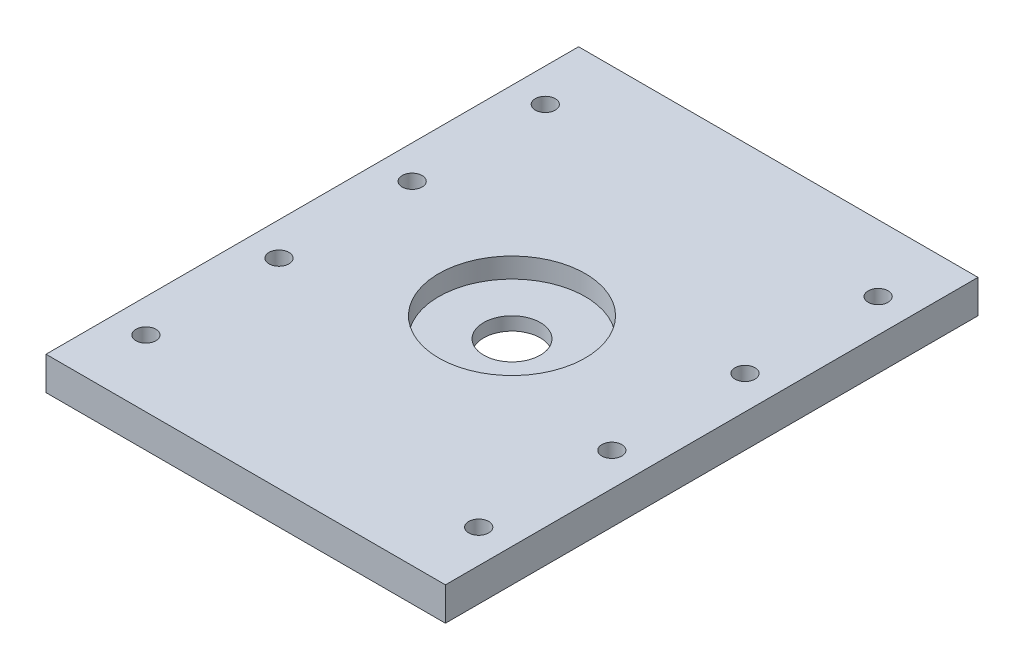
ISO-10303-21;
HEADER;
FILE_DESCRIPTION(('STEP AP214'),'2;1');
FILE_NAME('part.step','',(''),(''),'','','');
FILE_SCHEMA(('AUTOMOTIVE_DESIGN { 1 0 10303 214 1 1 1 1 }'));
ENDSEC;
DATA;
#1=APPLICATION_CONTEXT('core data for automotive mechanical design processes');
#2=APPLICATION_PROTOCOL_DEFINITION('international standard','automotive_design',2000,#1);
#3=PRODUCT_CONTEXT('',#1,'mechanical');
#4=PRODUCT('Part','Part','',(#3));
#5=PRODUCT_RELATED_PRODUCT_CATEGORY('part','',(#4));
#6=PRODUCT_DEFINITION_FORMATION('','',#4);
#7=PRODUCT_DEFINITION_CONTEXT('part definition',#1,'design');
#8=PRODUCT_DEFINITION('design','',#6,#7);
#9=PRODUCT_DEFINITION_SHAPE('','',#8);
#10=(LENGTH_UNIT() NAMED_UNIT(*) SI_UNIT(.MILLI.,.METRE.));
#11=(NAMED_UNIT(*) PLANE_ANGLE_UNIT() SI_UNIT($,.RADIAN.));
#12=(NAMED_UNIT(*) SI_UNIT($,.STERADIAN.) SOLID_ANGLE_UNIT());
#13=UNCERTAINTY_MEASURE_WITH_UNIT(LENGTH_MEASURE(1.E-05),#10,'distance_accuracy_value','');
#14=(GEOMETRIC_REPRESENTATION_CONTEXT(3) GLOBAL_UNCERTAINTY_ASSIGNED_CONTEXT((#13)) GLOBAL_UNIT_ASSIGNED_CONTEXT((#10,
#11,#12)) REPRESENTATION_CONTEXT('',''));
#15=CARTESIAN_POINT('',(0.,0.,0.));
#16=DIRECTION('',(0.,0.,1.));
#17=DIRECTION('',(1.,0.,0.));
#18=AXIS2_PLACEMENT_3D('',#15,#16,#17);
#19=CARTESIAN_POINT('',(0.,5.,0.));
#20=DIRECTION('',(0.,-1.,0.));
#21=DIRECTION('',(0.,0.,-1.));
#22=AXIS2_PLACEMENT_3D('',#19,#20,#21);
#23=CYLINDRICAL_SURFACE('',#22,4.25);
#24=CARTESIAN_POINT('',(0.,0.,0.));
#25=DIRECTION('',(0.,1.,0.));
#26=DIRECTION('',(0.,0.,1.));
#27=AXIS2_PLACEMENT_3D('',#24,#25,#26);
#28=CIRCLE('',#27,4.25);
#29=CARTESIAN_POINT('',(0.,0.,4.25000000000001));
#30=VERTEX_POINT('',#29);
#31=EDGE_CURVE('E173',#30,#30,#28,.T.);
#32=ORIENTED_EDGE('',*,*,#31,.F.);
#33=EDGE_LOOP('',(#32));
#34=FACE_BOUND('',#33,.T.);
#35=CARTESIAN_POINT('',(0.,2.,0.));
#36=DIRECTION('',(0.,1.,0.));
#37=DIRECTION('',(0.,0.,1.));
#38=AXIS2_PLACEMENT_3D('',#35,#36,#37);
#39=CIRCLE('',#38,4.25);
#40=CARTESIAN_POINT('',(0.,2.,4.25000000000001));
#41=VERTEX_POINT('',#40);
#42=EDGE_CURVE('E47',#41,#41,#39,.T.);
#43=ORIENTED_EDGE('',*,*,#42,.T.);
#44=EDGE_LOOP('',(#43));
#45=FACE_BOUND('',#44,.T.);
#46=ADVANCED_FACE('F43',(#34,#45),#23,.F.);
#47=CARTESIAN_POINT('',(0.,5.,0.));
#48=DIRECTION('',(0.,1.,0.));
#49=DIRECTION('',(0.,0.,1.));
#50=AXIS2_PLACEMENT_3D('',#47,#48,#49);
#51=PLANE('',#50);
#52=CARTESIAN_POINT('',(0.,5.,0.));
#53=DIRECTION('',(0.,1.,0.));
#54=DIRECTION('',(0.,0.,1.));
#55=AXIS2_PLACEMENT_3D('',#52,#53,#54);
#56=CIRCLE('',#55,11.);
#57=CARTESIAN_POINT('',(0.,5.,11.));
#58=VERTEX_POINT('',#57);
#59=EDGE_CURVE('E204',#58,#58,#56,.T.);
#60=ORIENTED_EDGE('',*,*,#59,.F.);
#61=EDGE_LOOP('',(#60));
#62=FACE_BOUND('',#61,.T.);
#63=CARTESIAN_POINT('',(-24.9999999999996,5.,10.));
#64=DIRECTION('',(0.,1.,0.));
#65=DIRECTION('',(0.,0.,1.));
#66=AXIS2_PLACEMENT_3D('',#63,#64,#65);
#67=CIRCLE('',#66,1.5);
#68=CARTESIAN_POINT('',(-24.9999999999996,5.,11.5));
#69=VERTEX_POINT('',#68);
#70=EDGE_CURVE('E185',#69,#69,#67,.T.);
#71=ORIENTED_EDGE('',*,*,#70,.F.);
#72=EDGE_LOOP('',(#71));
#73=FACE_BOUND('',#72,.T.);
#74=CARTESIAN_POINT('',(25.0000000000004,5.,10.));
#75=DIRECTION('',(0.,1.,0.));
#76=DIRECTION('',(0.,0.,1.));
#77=AXIS2_PLACEMENT_3D('',#74,#75,#76);
#78=CIRCLE('',#77,1.5);
#79=CARTESIAN_POINT('',(25.0000000000004,5.,11.5));
#80=VERTEX_POINT('',#79);
#81=EDGE_CURVE('E157',#80,#80,#78,.T.);
#82=ORIENTED_EDGE('',*,*,#81,.F.);
#83=EDGE_LOOP('',(#82));
#84=FACE_BOUND('',#83,.T.);
#85=CARTESIAN_POINT('',(25.,5.,-30.));
#86=DIRECTION('',(0.,1.,0.));
#87=DIRECTION('',(0.,0.,1.));
#88=AXIS2_PLACEMENT_3D('',#85,#86,#87);
#89=CIRCLE('',#88,1.5);
#90=CARTESIAN_POINT('',(25.,5.,-28.5));
#91=VERTEX_POINT('',#90);
#92=EDGE_CURVE('E141',#91,#91,#89,.T.);
#93=ORIENTED_EDGE('',*,*,#92,.F.);
#94=EDGE_LOOP('',(#93));
#95=FACE_BOUND('',#94,.T.);
#96=DIRECTION('',(0.,0.,-1.));
#97=VECTOR('',#96,1.);
#98=CARTESIAN_POINT('',(30.,5.,-40.));
#99=LINE('',#98,#97);
#100=CARTESIAN_POINT('',(30.,5.,40.));
#101=VERTEX_POINT('',#100);
#102=CARTESIAN_POINT('',(30.,5.,-40.));
#103=VERTEX_POINT('',#102);
#104=EDGE_CURVE('E98',#101,#103,#99,.T.);
#105=ORIENTED_EDGE('',*,*,#104,.T.);
#106=DIRECTION('',(-1.,0.,0.));
#107=VECTOR('',#106,1.);
#108=CARTESIAN_POINT('',(-30.,5.,-40.));
#109=LINE('',#108,#107);
#110=CARTESIAN_POINT('',(-30.,5.,-40.));
#111=VERTEX_POINT('',#110);
#112=EDGE_CURVE('E92',#103,#111,#109,.T.);
#113=ORIENTED_EDGE('',*,*,#112,.T.);
#114=DIRECTION('',(0.,0.,1.));
#115=VECTOR('',#114,1.);
#116=CARTESIAN_POINT('',(-30.,5.,-40.));
#117=LINE('',#116,#115);
#118=CARTESIAN_POINT('',(-30.,5.,40.));
#119=VERTEX_POINT('',#118);
#120=EDGE_CURVE('E96',#111,#119,#117,.T.);
#121=ORIENTED_EDGE('',*,*,#120,.T.);
#122=DIRECTION('',(1.,0.,0.));
#123=VECTOR('',#122,1.);
#124=CARTESIAN_POINT('',(-30.,5.,40.));
#125=LINE('',#124,#123);
#126=EDGE_CURVE('E62',#119,#101,#125,.T.);
#127=ORIENTED_EDGE('',*,*,#126,.T.);
#128=EDGE_LOOP('',(#105,#113,#121,#127));
#129=FACE_BOUND('',#128,.T.);
#130=CARTESIAN_POINT('',(-25.,5.,-30.));
#131=DIRECTION('',(0.,1.,0.));
#132=DIRECTION('',(0.,0.,1.));
#133=AXIS2_PLACEMENT_3D('',#130,#131,#132);
#134=CIRCLE('',#133,1.5);
#135=CARTESIAN_POINT('',(-25.,5.,-28.5));
#136=VERTEX_POINT('',#135);
#137=EDGE_CURVE('E119',#136,#136,#134,.T.);
#138=ORIENTED_EDGE('',*,*,#137,.F.);
#139=EDGE_LOOP('',(#138));
#140=FACE_BOUND('',#139,.T.);
#141=CARTESIAN_POINT('',(25.0000000000002,5.,-10.));
#142=DIRECTION('',(0.,1.,0.));
#143=DIRECTION('',(0.,0.,1.));
#144=AXIS2_PLACEMENT_3D('',#141,#142,#143);
#145=CIRCLE('',#144,1.5);
#146=CARTESIAN_POINT('',(25.0000000000002,5.,-8.5));
#147=VERTEX_POINT('',#146);
#148=EDGE_CURVE('E149',#147,#147,#145,.T.);
#149=ORIENTED_EDGE('',*,*,#148,.F.);
#150=EDGE_LOOP('',(#149));
#151=FACE_BOUND('',#150,.T.);
#152=CARTESIAN_POINT('',(25.0000000000006,5.,30.));
#153=DIRECTION('',(0.,1.,0.));
#154=DIRECTION('',(0.,0.,1.));
#155=AXIS2_PLACEMENT_3D('',#152,#153,#154);
#156=CIRCLE('',#155,1.5);
#157=CARTESIAN_POINT('',(25.0000000000006,5.,31.5));
#158=VERTEX_POINT('',#157);
#159=EDGE_CURVE('E165',#158,#158,#156,.T.);
#160=ORIENTED_EDGE('',*,*,#159,.F.);
#161=EDGE_LOOP('',(#160));
#162=FACE_BOUND('',#161,.T.);
#163=CARTESIAN_POINT('',(-24.9999999999998,5.,-10.));
#164=DIRECTION('',(0.,1.,0.));
#165=DIRECTION('',(0.,0.,1.));
#166=AXIS2_PLACEMENT_3D('',#163,#164,#165);
#167=CIRCLE('',#166,1.5);
#168=CARTESIAN_POINT('',(-24.9999999999998,5.,-8.5));
#169=VERTEX_POINT('',#168);
#170=EDGE_CURVE('E180',#169,#169,#167,.T.);
#171=ORIENTED_EDGE('',*,*,#170,.F.);
#172=EDGE_LOOP('',(#171));
#173=FACE_BOUND('',#172,.T.);
#174=CARTESIAN_POINT('',(-24.9999999999994,5.,30.));
#175=DIRECTION('',(0.,1.,0.));
#176=DIRECTION('',(0.,0.,1.));
#177=AXIS2_PLACEMENT_3D('',#174,#175,#176);
#178=CIRCLE('',#177,1.5);
#179=CARTESIAN_POINT('',(-24.9999999999994,5.,31.5));
#180=VERTEX_POINT('',#179);
#181=EDGE_CURVE('E193',#180,#180,#178,.T.);
#182=ORIENTED_EDGE('',*,*,#181,.F.);
#183=EDGE_LOOP('',(#182));
#184=FACE_BOUND('',#183,.T.);
#185=ADVANCED_FACE('F93',(#62,#73,#84,#95,#129,#140,#151,#162,#173,#184),#51,.T.);
#186=CARTESIAN_POINT('',(0.,0.,0.));
#187=DIRECTION('',(0.,1.,0.));
#188=DIRECTION('',(0.,0.,1.));
#189=AXIS2_PLACEMENT_3D('',#186,#187,#188);
#190=PLANE('',#189);
#191=DIRECTION('',(0.,0.,-1.));
#192=VECTOR('',#191,1.);
#193=CARTESIAN_POINT('',(30.,0.,-40.));
#194=LINE('',#193,#192);
#195=CARTESIAN_POINT('',(30.,0.,40.));
#196=VERTEX_POINT('',#195);
#197=CARTESIAN_POINT('',(30.,0.,-40.));
#198=VERTEX_POINT('',#197);
#199=EDGE_CURVE('E115',#196,#198,#194,.T.);
#200=ORIENTED_EDGE('',*,*,#199,.F.);
#201=DIRECTION('',(1.,0.,0.));
#202=VECTOR('',#201,1.);
#203=CARTESIAN_POINT('',(-30.,0.,40.));
#204=LINE('',#203,#202);
#205=CARTESIAN_POINT('',(-30.,0.,40.));
#206=VERTEX_POINT('',#205);
#207=EDGE_CURVE('E85',#206,#196,#204,.T.);
#208=ORIENTED_EDGE('',*,*,#207,.F.);
#209=DIRECTION('',(0.,0.,1.));
#210=VECTOR('',#209,1.);
#211=CARTESIAN_POINT('',(-30.,0.,-40.));
#212=LINE('',#211,#210);
#213=CARTESIAN_POINT('',(-30.,0.,-40.));
#214=VERTEX_POINT('',#213);
#215=EDGE_CURVE('E79',#214,#206,#212,.T.);
#216=ORIENTED_EDGE('',*,*,#215,.F.);
#217=DIRECTION('',(-1.,0.,0.));
#218=VECTOR('',#217,1.);
#219=CARTESIAN_POINT('',(-30.,0.,-40.));
#220=LINE('',#219,#218);
#221=EDGE_CURVE('E103',#198,#214,#220,.T.);
#222=ORIENTED_EDGE('',*,*,#221,.F.);
#223=EDGE_LOOP('',(#200,#208,#216,#222));
#224=FACE_BOUND('',#223,.T.);
#225=CARTESIAN_POINT('',(-25.,0.,-30.));
#226=DIRECTION('',(0.,1.,0.));
#227=DIRECTION('',(0.,0.,1.));
#228=AXIS2_PLACEMENT_3D('',#225,#226,#227);
#229=CIRCLE('',#228,1.5);
#230=CARTESIAN_POINT('',(-25.,0.,-28.5));
#231=VERTEX_POINT('',#230);
#232=EDGE_CURVE('E137',#231,#231,#229,.T.);
#233=ORIENTED_EDGE('',*,*,#232,.T.);
#234=EDGE_LOOP('',(#233));
#235=FACE_BOUND('',#234,.T.);
#236=CARTESIAN_POINT('',(25.,0.,-30.));
#237=DIRECTION('',(0.,1.,0.));
#238=DIRECTION('',(0.,0.,1.));
#239=AXIS2_PLACEMENT_3D('',#236,#237,#238);
#240=CIRCLE('',#239,1.5);
#241=CARTESIAN_POINT('',(25.,0.,-28.5));
#242=VERTEX_POINT('',#241);
#243=EDGE_CURVE('E145',#242,#242,#240,.T.);
#244=ORIENTED_EDGE('',*,*,#243,.T.);
#245=EDGE_LOOP('',(#244));
#246=FACE_BOUND('',#245,.T.);
#247=CARTESIAN_POINT('',(25.0000000000002,0.,-10.));
#248=DIRECTION('',(0.,1.,0.));
#249=DIRECTION('',(0.,0.,1.));
#250=AXIS2_PLACEMENT_3D('',#247,#248,#249);
#251=CIRCLE('',#250,1.5);
#252=CARTESIAN_POINT('',(25.0000000000002,0.,-8.5));
#253=VERTEX_POINT('',#252);
#254=EDGE_CURVE('E153',#253,#253,#251,.T.);
#255=ORIENTED_EDGE('',*,*,#254,.T.);
#256=EDGE_LOOP('',(#255));
#257=FACE_BOUND('',#256,.T.);
#258=CARTESIAN_POINT('',(25.0000000000004,0.,10.));
#259=DIRECTION('',(0.,1.,0.));
#260=DIRECTION('',(0.,0.,1.));
#261=AXIS2_PLACEMENT_3D('',#258,#259,#260);
#262=CIRCLE('',#261,1.5);
#263=CARTESIAN_POINT('',(25.0000000000004,0.,11.5));
#264=VERTEX_POINT('',#263);
#265=EDGE_CURVE('E161',#264,#264,#262,.T.);
#266=ORIENTED_EDGE('',*,*,#265,.T.);
#267=EDGE_LOOP('',(#266));
#268=FACE_BOUND('',#267,.T.);
#269=CARTESIAN_POINT('',(25.0000000000006,0.,30.));
#270=DIRECTION('',(0.,1.,0.));
#271=DIRECTION('',(0.,0.,1.));
#272=AXIS2_PLACEMENT_3D('',#269,#270,#271);
#273=CIRCLE('',#272,1.5);
#274=CARTESIAN_POINT('',(25.0000000000006,0.,31.5));
#275=VERTEX_POINT('',#274);
#276=EDGE_CURVE('E169',#275,#275,#273,.T.);
#277=ORIENTED_EDGE('',*,*,#276,.T.);
#278=EDGE_LOOP('',(#277));
#279=FACE_BOUND('',#278,.T.);
#280=ORIENTED_EDGE('',*,*,#31,.T.);
#281=EDGE_LOOP('',(#280));
#282=FACE_BOUND('',#281,.T.);
#283=CARTESIAN_POINT('',(-24.9999999999998,0.,-10.));
#284=DIRECTION('',(0.,1.,0.));
#285=DIRECTION('',(0.,0.,1.));
#286=AXIS2_PLACEMENT_3D('',#283,#284,#285);
#287=CIRCLE('',#286,1.5);
#288=CARTESIAN_POINT('',(-24.9999999999998,0.,-8.5));
#289=VERTEX_POINT('',#288);
#290=EDGE_CURVE('E181',#289,#289,#287,.T.);
#291=ORIENTED_EDGE('',*,*,#290,.T.);
#292=EDGE_LOOP('',(#291));
#293=FACE_BOUND('',#292,.T.);
#294=CARTESIAN_POINT('',(-24.9999999999996,0.,10.));
#295=DIRECTION('',(0.,1.,0.));
#296=DIRECTION('',(0.,0.,1.));
#297=AXIS2_PLACEMENT_3D('',#294,#295,#296);
#298=CIRCLE('',#297,1.5);
#299=CARTESIAN_POINT('',(-24.9999999999996,0.,11.5));
#300=VERTEX_POINT('',#299);
#301=EDGE_CURVE('E189',#300,#300,#298,.T.);
#302=ORIENTED_EDGE('',*,*,#301,.T.);
#303=EDGE_LOOP('',(#302));
#304=FACE_BOUND('',#303,.T.);
#305=CARTESIAN_POINT('',(-24.9999999999994,0.,30.));
#306=DIRECTION('',(0.,1.,0.));
#307=DIRECTION('',(0.,0.,1.));
#308=AXIS2_PLACEMENT_3D('',#305,#306,#307);
#309=CIRCLE('',#308,1.5);
#310=CARTESIAN_POINT('',(-24.9999999999994,0.,31.5));
#311=VERTEX_POINT('',#310);
#312=EDGE_CURVE('E197',#311,#311,#309,.T.);
#313=ORIENTED_EDGE('',*,*,#312,.T.);
#314=EDGE_LOOP('',(#313));
#315=FACE_BOUND('',#314,.T.);
#316=ADVANCED_FACE('F132',(#224,#235,#246,#257,#268,#279,#282,#293,#304,#315),#190,.F.);
#317=CARTESIAN_POINT('',(30.,5.,-40.));
#318=DIRECTION('',(-1.,0.,0.));
#319=DIRECTION('',(0.,0.,1.));
#320=AXIS2_PLACEMENT_3D('',#317,#318,#319);
#321=PLANE('',#320);
#322=ORIENTED_EDGE('',*,*,#199,.T.);
#323=DIRECTION('',(0.,-1.,0.));
#324=VECTOR('',#323,1.);
#325=CARTESIAN_POINT('',(30.,5.,-40.));
#326=LINE('',#325,#324);
#327=EDGE_CURVE('E11',#103,#198,#326,.T.);
#328=ORIENTED_EDGE('',*,*,#327,.F.);
#329=ORIENTED_EDGE('',*,*,#104,.F.);
#330=DIRECTION('',(0.,-1.,0.));
#331=VECTOR('',#330,1.);
#332=CARTESIAN_POINT('',(30.,5.,40.));
#333=LINE('',#332,#331);
#334=EDGE_CURVE('E111',#101,#196,#333,.T.);
#335=ORIENTED_EDGE('',*,*,#334,.T.);
#336=EDGE_LOOP('',(#322,#328,#329,#335));
#337=FACE_BOUND('',#336,.T.);
#338=ADVANCED_FACE('F45',(#337),#321,.F.);
#339=CARTESIAN_POINT('',(-30.,5.,-40.));
#340=DIRECTION('',(0.,0.,1.));
#341=DIRECTION('',(1.,0.,0.));
#342=AXIS2_PLACEMENT_3D('',#339,#340,#341);
#343=PLANE('',#342);
#344=ORIENTED_EDGE('',*,*,#221,.T.);
#345=DIRECTION('',(0.,-1.,0.));
#346=VECTOR('',#345,1.);
#347=CARTESIAN_POINT('',(-30.,5.,-40.));
#348=LINE('',#347,#346);
#349=EDGE_CURVE('E54',#111,#214,#348,.T.);
#350=ORIENTED_EDGE('',*,*,#349,.F.);
#351=ORIENTED_EDGE('',*,*,#112,.F.);
#352=ORIENTED_EDGE('',*,*,#327,.T.);
#353=EDGE_LOOP('',(#344,#350,#351,#352));
#354=FACE_BOUND('',#353,.T.);
#355=ADVANCED_FACE('F102',(#354),#343,.F.);
#356=CARTESIAN_POINT('',(-30.,5.,-40.));
#357=DIRECTION('',(1.,0.,0.));
#358=DIRECTION('',(0.,0.,-1.));
#359=AXIS2_PLACEMENT_3D('',#356,#357,#358);
#360=PLANE('',#359);
#361=ORIENTED_EDGE('',*,*,#215,.T.);
#362=DIRECTION('',(0.,-1.,0.));
#363=VECTOR('',#362,1.);
#364=CARTESIAN_POINT('',(-30.,5.,40.));
#365=LINE('',#364,#363);
#366=EDGE_CURVE('E105',#119,#206,#365,.T.);
#367=ORIENTED_EDGE('',*,*,#366,.F.);
#368=ORIENTED_EDGE('',*,*,#120,.F.);
#369=ORIENTED_EDGE('',*,*,#349,.T.);
#370=EDGE_LOOP('',(#361,#367,#368,#369));
#371=FACE_BOUND('',#370,.T.);
#372=ADVANCED_FACE('F107',(#371),#360,.F.);
#373=CARTESIAN_POINT('',(-30.,5.,40.));
#374=DIRECTION('',(0.,0.,-1.));
#375=DIRECTION('',(-1.,0.,0.));
#376=AXIS2_PLACEMENT_3D('',#373,#374,#375);
#377=PLANE('',#376);
#378=ORIENTED_EDGE('',*,*,#207,.T.);
#379=ORIENTED_EDGE('',*,*,#334,.F.);
#380=ORIENTED_EDGE('',*,*,#126,.F.);
#381=ORIENTED_EDGE('',*,*,#366,.T.);
#382=EDGE_LOOP('',(#378,#379,#380,#381));
#383=FACE_BOUND('',#382,.T.);
#384=ADVANCED_FACE('F129',(#383),#377,.F.);
#385=CARTESIAN_POINT('',(-25.,5.,-30.));
#386=DIRECTION('',(0.,-1.,0.));
#387=DIRECTION('',(0.,0.,-1.));
#388=AXIS2_PLACEMENT_3D('',#385,#386,#387);
#389=CYLINDRICAL_SURFACE('',#388,1.5);
#390=ORIENTED_EDGE('',*,*,#137,.T.);
#391=EDGE_LOOP('',(#390));
#392=FACE_BOUND('',#391,.T.);
#393=ORIENTED_EDGE('',*,*,#232,.F.);
#394=EDGE_LOOP('',(#393));
#395=FACE_BOUND('',#394,.T.);
#396=ADVANCED_FACE('F256',(#392,#395),#389,.F.);
#397=CARTESIAN_POINT('',(25.,5.,-30.));
#398=DIRECTION('',(0.,-1.,0.));
#399=DIRECTION('',(0.,0.,-1.));
#400=AXIS2_PLACEMENT_3D('',#397,#398,#399);
#401=CYLINDRICAL_SURFACE('',#400,1.5);
#402=ORIENTED_EDGE('',*,*,#92,.T.);
#403=EDGE_LOOP('',(#402));
#404=FACE_BOUND('',#403,.T.);
#405=ORIENTED_EDGE('',*,*,#243,.F.);
#406=EDGE_LOOP('',(#405));
#407=FACE_BOUND('',#406,.T.);
#408=ADVANCED_FACE('F252',(#404,#407),#401,.F.);
#409=CARTESIAN_POINT('',(25.0000000000002,5.,-10.));
#410=DIRECTION('',(0.,-1.,0.));
#411=DIRECTION('',(0.,0.,-1.));
#412=AXIS2_PLACEMENT_3D('',#409,#410,#411);
#413=CYLINDRICAL_SURFACE('',#412,1.5);
#414=ORIENTED_EDGE('',*,*,#148,.T.);
#415=EDGE_LOOP('',(#414));
#416=FACE_BOUND('',#415,.T.);
#417=ORIENTED_EDGE('',*,*,#254,.F.);
#418=EDGE_LOOP('',(#417));
#419=FACE_BOUND('',#418,.T.);
#420=ADVANCED_FACE('F248',(#416,#419),#413,.F.);
#421=CARTESIAN_POINT('',(25.0000000000004,5.,10.));
#422=DIRECTION('',(0.,-1.,0.));
#423=DIRECTION('',(0.,0.,-1.));
#424=AXIS2_PLACEMENT_3D('',#421,#422,#423);
#425=CYLINDRICAL_SURFACE('',#424,1.5);
#426=ORIENTED_EDGE('',*,*,#81,.T.);
#427=EDGE_LOOP('',(#426));
#428=FACE_BOUND('',#427,.T.);
#429=ORIENTED_EDGE('',*,*,#265,.F.);
#430=EDGE_LOOP('',(#429));
#431=FACE_BOUND('',#430,.T.);
#432=ADVANCED_FACE('F244',(#428,#431),#425,.F.);
#433=CARTESIAN_POINT('',(25.0000000000006,5.,30.));
#434=DIRECTION('',(0.,-1.,0.));
#435=DIRECTION('',(0.,0.,-1.));
#436=AXIS2_PLACEMENT_3D('',#433,#434,#435);
#437=CYLINDRICAL_SURFACE('',#436,1.5);
#438=ORIENTED_EDGE('',*,*,#159,.T.);
#439=EDGE_LOOP('',(#438));
#440=FACE_BOUND('',#439,.T.);
#441=ORIENTED_EDGE('',*,*,#276,.F.);
#442=EDGE_LOOP('',(#441));
#443=FACE_BOUND('',#442,.T.);
#444=ADVANCED_FACE('F241',(#440,#443),#437,.F.);
#445=CARTESIAN_POINT('',(-24.9999999999998,5.,-10.));
#446=DIRECTION('',(0.,-1.,0.));
#447=DIRECTION('',(0.,0.,-1.));
#448=AXIS2_PLACEMENT_3D('',#445,#446,#447);
#449=CYLINDRICAL_SURFACE('',#448,1.5);
#450=ORIENTED_EDGE('',*,*,#170,.T.);
#451=EDGE_LOOP('',(#450));
#452=FACE_BOUND('',#451,.T.);
#453=ORIENTED_EDGE('',*,*,#290,.F.);
#454=EDGE_LOOP('',(#453));
#455=FACE_BOUND('',#454,.T.);
#456=ADVANCED_FACE('F239',(#452,#455),#449,.F.);
#457=CARTESIAN_POINT('',(-24.9999999999996,5.,10.));
#458=DIRECTION('',(0.,-1.,0.));
#459=DIRECTION('',(0.,0.,-1.));
#460=AXIS2_PLACEMENT_3D('',#457,#458,#459);
#461=CYLINDRICAL_SURFACE('',#460,1.5);
#462=ORIENTED_EDGE('',*,*,#70,.T.);
#463=EDGE_LOOP('',(#462));
#464=FACE_BOUND('',#463,.T.);
#465=ORIENTED_EDGE('',*,*,#301,.F.);
#466=EDGE_LOOP('',(#465));
#467=FACE_BOUND('',#466,.T.);
#468=ADVANCED_FACE('F311',(#464,#467),#461,.F.);
#469=CARTESIAN_POINT('',(-24.9999999999994,5.,30.));
#470=DIRECTION('',(0.,-1.,0.));
#471=DIRECTION('',(0.,0.,-1.));
#472=AXIS2_PLACEMENT_3D('',#469,#470,#471);
#473=CYLINDRICAL_SURFACE('',#472,1.5);
#474=ORIENTED_EDGE('',*,*,#181,.T.);
#475=EDGE_LOOP('',(#474));
#476=FACE_BOUND('',#475,.T.);
#477=ORIENTED_EDGE('',*,*,#312,.F.);
#478=EDGE_LOOP('',(#477));
#479=FACE_BOUND('',#478,.T.);
#480=ADVANCED_FACE('F225',(#476,#479),#473,.F.);
#481=CARTESIAN_POINT('',(0.,2.,0.));
#482=DIRECTION('',(0.,1.,0.));
#483=DIRECTION('',(0.,0.,1.));
#484=AXIS2_PLACEMENT_3D('',#481,#482,#483);
#485=CYLINDRICAL_SURFACE('',#484,11.);
#486=CARTESIAN_POINT('',(0.,2.,0.));
#487=DIRECTION('',(0.,1.,0.));
#488=DIRECTION('',(0.,0.,1.));
#489=AXIS2_PLACEMENT_3D('',#486,#487,#488);
#490=CIRCLE('',#489,11.);
#491=CARTESIAN_POINT('',(0.,2.,11.));
#492=VERTEX_POINT('',#491);
#493=EDGE_CURVE('E208',#492,#492,#490,.T.);
#494=ORIENTED_EDGE('',*,*,#493,.F.);
#495=EDGE_LOOP('',(#494));
#496=FACE_BOUND('',#495,.T.);
#497=ORIENTED_EDGE('',*,*,#59,.T.);
#498=EDGE_LOOP('',(#497));
#499=FACE_BOUND('',#498,.T.);
#500=ADVANCED_FACE('F220',(#496,#499),#485,.F.);
#501=CARTESIAN_POINT('',(0.,2.,0.));
#502=DIRECTION('',(0.,1.,0.));
#503=DIRECTION('',(0.,0.,1.));
#504=AXIS2_PLACEMENT_3D('',#501,#502,#503);
#505=PLANE('',#504);
#506=ORIENTED_EDGE('',*,*,#42,.F.);
#507=EDGE_LOOP('',(#506));
#508=FACE_BOUND('',#507,.T.);
#509=ORIENTED_EDGE('',*,*,#493,.T.);
#510=EDGE_LOOP('',(#509));
#511=FACE_BOUND('',#510,.T.);
#512=ADVANCED_FACE('F218',(#508,#511),#505,.T.);
#513=CLOSED_SHELL('',(#46,#185,#316,#338,#355,#372,#384,#396,#408,#420,#432,#444,#456,#468,#480,
#500,#512));
#514=MANIFOLD_SOLID_BREP('B2',#513);
#515=ADVANCED_BREP_SHAPE_REPRESENTATION('',(#18,#514),#14);
#516=SHAPE_DEFINITION_REPRESENTATION(#9,#515);
ENDSEC;
END-ISO-10303-21;
